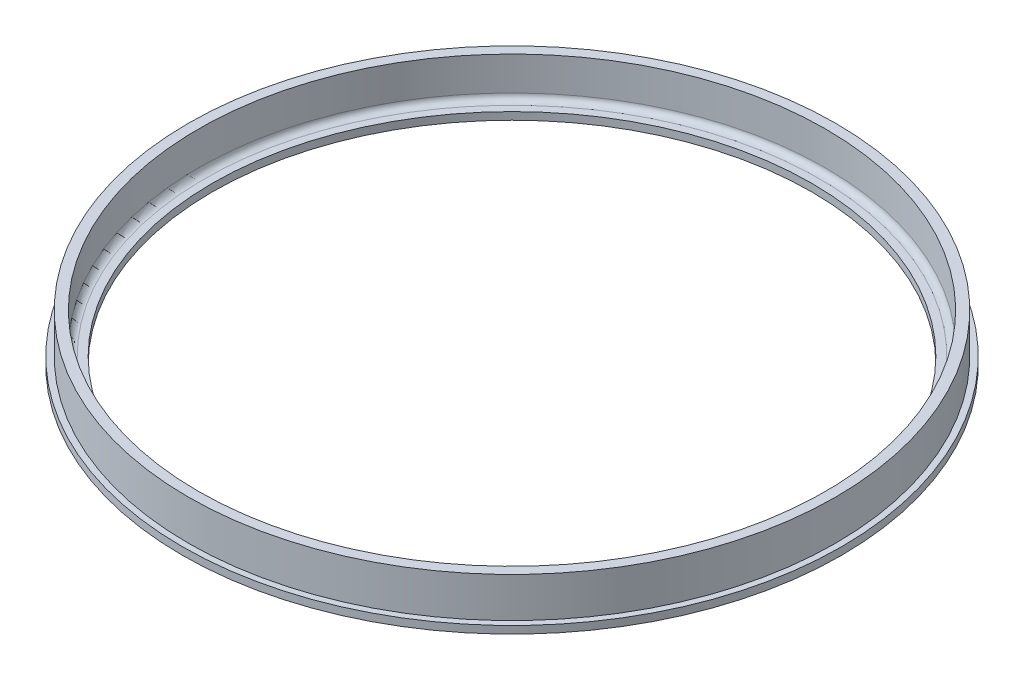
ISO-10303-21;
HEADER;
FILE_DESCRIPTION(('STEP AP214'),'2;1');
FILE_NAME('part.step','',(''),(''),'','','');
FILE_SCHEMA(('AUTOMOTIVE_DESIGN { 1 0 10303 214 1 1 1 1 }'));
ENDSEC;
DATA;
#1=APPLICATION_CONTEXT('core data for automotive mechanical design processes');
#2=APPLICATION_PROTOCOL_DEFINITION('international standard','automotive_design',2000,#1);
#3=PRODUCT_CONTEXT('',#1,'mechanical');
#4=PRODUCT('Part','Part','',(#3));
#5=PRODUCT_RELATED_PRODUCT_CATEGORY('part','',(#4));
#6=PRODUCT_DEFINITION_FORMATION('','',#4);
#7=PRODUCT_DEFINITION_CONTEXT('part definition',#1,'design');
#8=PRODUCT_DEFINITION('design','',#6,#7);
#9=PRODUCT_DEFINITION_SHAPE('','',#8);
#10=(LENGTH_UNIT() NAMED_UNIT(*) SI_UNIT(.MILLI.,.METRE.));
#11=(NAMED_UNIT(*) PLANE_ANGLE_UNIT() SI_UNIT($,.RADIAN.));
#12=(NAMED_UNIT(*) SI_UNIT($,.STERADIAN.) SOLID_ANGLE_UNIT());
#13=UNCERTAINTY_MEASURE_WITH_UNIT(LENGTH_MEASURE(1.E-05),#10,'distance_accuracy_value','');
#14=(GEOMETRIC_REPRESENTATION_CONTEXT(3) GLOBAL_UNCERTAINTY_ASSIGNED_CONTEXT((#13)) GLOBAL_UNIT_ASSIGNED_CONTEXT((#10,
#11,#12)) REPRESENTATION_CONTEXT('',''));
#15=CARTESIAN_POINT('',(0.,0.,0.));
#16=DIRECTION('',(0.,0.,1.));
#17=DIRECTION('',(1.,0.,0.));
#18=AXIS2_PLACEMENT_3D('',#15,#16,#17);
#19=CARTESIAN_POINT('',(0.,0.,0.));
#20=DIRECTION('',(0.,-1.,0.));
#21=DIRECTION('',(0.,0.,-1.));
#22=AXIS2_PLACEMENT_3D('',#19,#20,#21);
#23=CYLINDRICAL_SURFACE('',#22,76.2);
#24=CARTESIAN_POINT('',(0.,-19.3305476381389,0.));
#25=DIRECTION('',(0.,-1.,0.));
#26=DIRECTION('',(0.,0.,-1.));
#27=AXIS2_PLACEMENT_3D('',#24,#25,#26);
#28=CIRCLE('',#27,76.2);
#29=CARTESIAN_POINT('',(0.,-19.3305476381389,-76.2));
#30=VERTEX_POINT('',#29);
#31=EDGE_CURVE('E60',#30,#30,#28,.T.);
#32=ORIENTED_EDGE('',*,*,#31,.T.);
#33=EDGE_LOOP('',(#32));
#34=FACE_BOUND('',#33,.T.);
#35=CARTESIAN_POINT('',(0.,-17.4255476381389,0.));
#36=DIRECTION('',(0.,1.,0.));
#37=DIRECTION('',(0.,0.,1.));
#38=AXIS2_PLACEMENT_3D('',#35,#36,#37);
#39=CIRCLE('',#38,76.2);
#40=CARTESIAN_POINT('',(0.,-17.4255476381389,76.2));
#41=VERTEX_POINT('',#40);
#42=EDGE_CURVE('E63',#41,#41,#39,.F.);
#43=ORIENTED_EDGE('',*,*,#42,.F.);
#44=EDGE_LOOP('',(#43));
#45=FACE_BOUND('',#44,.T.);
#46=ADVANCED_FACE('F34',(#34,#45),#23,.F.);
#47=CARTESIAN_POINT('',(-76.2,-19.3305476381389,0.));
#48=DIRECTION('',(0.,1.,0.));
#49=DIRECTION('',(0.,0.,1.));
#50=AXIS2_PLACEMENT_3D('',#47,#48,#49);
#51=PLANE('',#50);
#52=ORIENTED_EDGE('',*,*,#31,.F.);
#53=EDGE_LOOP('',(#52));
#54=FACE_BOUND('',#53,.T.);
#55=CARTESIAN_POINT('',(0.,-19.3305476381389,0.));
#56=DIRECTION('',(0.,-1.,0.));
#57=DIRECTION('',(0.,0.,-1.));
#58=AXIS2_PLACEMENT_3D('',#55,#56,#57);
#59=CIRCLE('',#58,83.82);
#60=CARTESIAN_POINT('',(0.,-19.3305476381389,-83.82));
#61=VERTEX_POINT('',#60);
#62=EDGE_CURVE('E45',#61,#61,#59,.T.);
#63=ORIENTED_EDGE('',*,*,#62,.T.);
#64=EDGE_LOOP('',(#63));
#65=FACE_BOUND('',#64,.T.);
#66=ADVANCED_FACE('F73',(#54,#65),#51,.F.);
#67=CARTESIAN_POINT('',(0.,0.,0.));
#68=DIRECTION('',(0.,-1.,0.));
#69=DIRECTION('',(0.,0.,-1.));
#70=AXIS2_PLACEMENT_3D('',#67,#68,#69);
#71=CYLINDRICAL_SURFACE('',#70,83.82);
#72=ORIENTED_EDGE('',*,*,#62,.F.);
#73=EDGE_LOOP('',(#72));
#74=FACE_BOUND('',#73,.T.);
#75=CARTESIAN_POINT('',(0.,-17.4255476381389,0.));
#76=DIRECTION('',(0.,-1.,0.));
#77=DIRECTION('',(0.,0.,-1.));
#78=AXIS2_PLACEMENT_3D('',#75,#76,#77);
#79=CIRCLE('',#78,83.82);
#80=CARTESIAN_POINT('',(0.,-17.4255476381389,-83.82));
#81=VERTEX_POINT('',#80);
#82=EDGE_CURVE('E49',#81,#81,#79,.T.);
#83=ORIENTED_EDGE('',*,*,#82,.T.);
#84=EDGE_LOOP('',(#83));
#85=FACE_BOUND('',#84,.T.);
#86=ADVANCED_FACE('F79',(#74,#85),#71,.T.);
#87=CARTESIAN_POINT('',(-83.82,-17.4255476381389,0.));
#88=DIRECTION('',(0.,-1.,0.));
#89=DIRECTION('',(0.,0.,-1.));
#90=AXIS2_PLACEMENT_3D('',#87,#88,#89);
#91=PLANE('',#90);
#92=ORIENTED_EDGE('',*,*,#82,.F.);
#93=EDGE_LOOP('',(#92));
#94=FACE_BOUND('',#93,.T.);
#95=CARTESIAN_POINT('',(0.,-17.4255476381389,0.));
#96=DIRECTION('',(0.,-1.,0.));
#97=DIRECTION('',(0.,0.,-1.));
#98=AXIS2_PLACEMENT_3D('',#95,#96,#97);
#99=CIRCLE('',#98,82.296);
#100=CARTESIAN_POINT('',(0.,-17.4255476381389,-82.296));
#101=VERTEX_POINT('',#100);
#102=EDGE_CURVE('E54',#101,#101,#99,.T.);
#103=ORIENTED_EDGE('',*,*,#102,.T.);
#104=EDGE_LOOP('',(#103));
#105=FACE_BOUND('',#104,.T.);
#106=ADVANCED_FACE('F92',(#94,#105),#91,.F.);
#107=CARTESIAN_POINT('',(0.,0.,0.));
#108=DIRECTION('',(0.,-1.,0.));
#109=DIRECTION('',(0.,0.,-1.));
#110=AXIS2_PLACEMENT_3D('',#107,#108,#109);
#111=CYLINDRICAL_SURFACE('',#110,82.296);
#112=ORIENTED_EDGE('',*,*,#102,.F.);
#113=EDGE_LOOP('',(#112));
#114=FACE_BOUND('',#113,.T.);
#115=CARTESIAN_POINT('',(0.,-7.26554763813889,0.));
#116=DIRECTION('',(0.,-1.,0.));
#117=DIRECTION('',(0.,0.,-1.));
#118=AXIS2_PLACEMENT_3D('',#115,#116,#117);
#119=CIRCLE('',#118,82.296);
#120=CARTESIAN_POINT('',(0.,-7.26554763813889,-82.296));
#121=VERTEX_POINT('',#120);
#122=EDGE_CURVE('E57',#121,#121,#119,.T.);
#123=ORIENTED_EDGE('',*,*,#122,.T.);
#124=EDGE_LOOP('',(#123));
#125=FACE_BOUND('',#124,.T.);
#126=ADVANCED_FACE('F88',(#114,#125),#111,.T.);
#127=CARTESIAN_POINT('',(-76.2,-7.26554763813889,0.));
#128=DIRECTION('',(0.,-1.,0.));
#129=DIRECTION('',(0.,0.,-1.));
#130=AXIS2_PLACEMENT_3D('',#127,#128,#129);
#131=PLANE('',#130);
#132=CARTESIAN_POINT('',(0.,-7.26554763813889,0.));
#133=DIRECTION('',(0.,1.,0.));
#134=DIRECTION('',(0.,0.,1.));
#135=AXIS2_PLACEMENT_3D('',#132,#133,#134);
#136=CIRCLE('',#135,79.756);
#137=CARTESIAN_POINT('',(0.,-7.26554763813889,79.756));
#138=VERTEX_POINT('',#137);
#139=EDGE_CURVE('E64',#138,#138,#136,.T.);
#140=ORIENTED_EDGE('',*,*,#139,.F.);
#141=EDGE_LOOP('',(#140));
#142=FACE_BOUND('',#141,.T.);
#143=ORIENTED_EDGE('',*,*,#122,.F.);
#144=EDGE_LOOP('',(#143));
#145=FACE_BOUND('',#144,.T.);
#146=ADVANCED_FACE('F85',(#142,#145),#131,.F.);
#147=CARTESIAN_POINT('',(0.,-17.4255476381389,0.));
#148=DIRECTION('',(0.,1.,0.));
#149=DIRECTION('',(0.,0.,1.));
#150=AXIS2_PLACEMENT_3D('',#147,#148,#149);
#151=CYLINDRICAL_SURFACE('',#150,79.756);
#152=CARTESIAN_POINT('',(0.,-15.8380476381389,0.));
#153=DIRECTION('',(0.,1.,0.));
#154=DIRECTION('',(0.,0.,1.));
#155=AXIS2_PLACEMENT_3D('',#152,#153,#154);
#156=CIRCLE('',#155,79.756);
#157=CARTESIAN_POINT('',(0.,-15.8380476381389,79.756));
#158=VERTEX_POINT('',#157);
#159=EDGE_CURVE('E10',#158,#158,#156,.F.);
#160=ORIENTED_EDGE('',*,*,#159,.T.);
#161=EDGE_LOOP('',(#160));
#162=FACE_BOUND('',#161,.T.);
#163=ORIENTED_EDGE('',*,*,#139,.T.);
#164=EDGE_LOOP('',(#163));
#165=FACE_BOUND('',#164,.T.);
#166=ADVANCED_FACE('F83',(#162,#165),#151,.F.);
#167=CARTESIAN_POINT('',(0.,-17.4255476381389,0.));
#168=DIRECTION('',(0.,1.,0.));
#169=DIRECTION('',(0.,0.,1.));
#170=AXIS2_PLACEMENT_3D('',#167,#168,#169);
#171=PLANE('',#170);
#172=CARTESIAN_POINT('',(0.,-17.4255476381389,0.));
#173=DIRECTION('',(0.,1.,0.));
#174=DIRECTION('',(0.,0.,1.));
#175=AXIS2_PLACEMENT_3D('',#172,#173,#174);
#176=CIRCLE('',#175,78.1685);
#177=CARTESIAN_POINT('',(0.,-17.4255476381389,78.1685));
#178=VERTEX_POINT('',#177);
#179=EDGE_CURVE('E41',#178,#178,#176,.T.);
#180=ORIENTED_EDGE('',*,*,#179,.T.);
#181=EDGE_LOOP('',(#180));
#182=FACE_BOUND('',#181,.T.);
#183=ORIENTED_EDGE('',*,*,#42,.T.);
#184=EDGE_LOOP('',(#183));
#185=FACE_BOUND('',#184,.T.);
#186=ADVANCED_FACE('F70',(#182,#185),#171,.T.);
#187=CARTESIAN_POINT('',(0.,-15.8380476381389,0.));
#188=DIRECTION('',(0.,1.,0.));
#189=DIRECTION('',(0.,0.,1.));
#190=AXIS2_PLACEMENT_3D('',#187,#188,#189);
#191=TOROIDAL_SURFACE('',#190,78.1685,1.5875);
#192=ORIENTED_EDGE('',*,*,#159,.F.);
#193=EDGE_LOOP('',(#192));
#194=FACE_BOUND('',#193,.T.);
#195=ORIENTED_EDGE('',*,*,#179,.F.);
#196=EDGE_LOOP('',(#195));
#197=FACE_BOUND('',#196,.T.);
#198=ADVANCED_FACE('F36',(#194,#197),#191,.F.);
#199=CLOSED_SHELL('',(#46,#66,#86,#106,#126,#146,#166,#186,#198));
#200=MANIFOLD_SOLID_BREP('B2',#199);
#201=ADVANCED_BREP_SHAPE_REPRESENTATION('',(#18,#200),#14);
#202=SHAPE_DEFINITION_REPRESENTATION(#9,#201);
ENDSEC;
END-ISO-10303-21;
